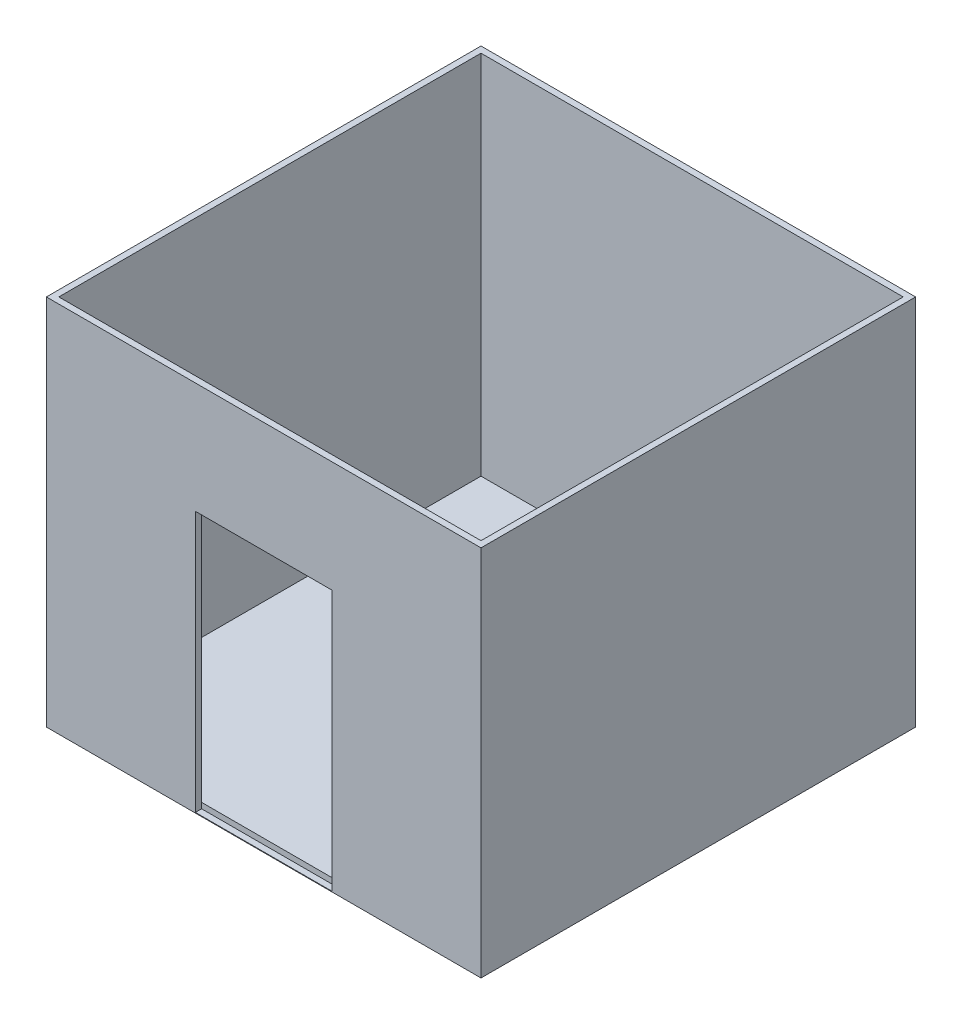
ISO-10303-21;
HEADER;
FILE_DESCRIPTION(('STEP AP214'),'2;1');
FILE_NAME('part.step','',(''),(''),'','','');
FILE_SCHEMA(('AUTOMOTIVE_DESIGN { 1 0 10303 214 1 1 1 1 }'));
ENDSEC;
DATA;
#1=APPLICATION_CONTEXT('core data for automotive mechanical design processes');
#2=APPLICATION_PROTOCOL_DEFINITION('international standard','automotive_design',2000,#1);
#3=PRODUCT_CONTEXT('',#1,'mechanical');
#4=PRODUCT('Part','Part','',(#3));
#5=PRODUCT_RELATED_PRODUCT_CATEGORY('part','',(#4));
#6=PRODUCT_DEFINITION_FORMATION('','',#4);
#7=PRODUCT_DEFINITION_CONTEXT('part definition',#1,'design');
#8=PRODUCT_DEFINITION('design','',#6,#7);
#9=PRODUCT_DEFINITION_SHAPE('','',#8);
#10=(LENGTH_UNIT() NAMED_UNIT(*) SI_UNIT(.MILLI.,.METRE.));
#11=(NAMED_UNIT(*) PLANE_ANGLE_UNIT() SI_UNIT($,.RADIAN.));
#12=(NAMED_UNIT(*) SI_UNIT($,.STERADIAN.) SOLID_ANGLE_UNIT());
#13=UNCERTAINTY_MEASURE_WITH_UNIT(LENGTH_MEASURE(1.E-05),#10,'distance_accuracy_value','');
#14=(GEOMETRIC_REPRESENTATION_CONTEXT(3) GLOBAL_UNCERTAINTY_ASSIGNED_CONTEXT((#13)) GLOBAL_UNIT_ASSIGNED_CONTEXT((#10,
#11,#12)) REPRESENTATION_CONTEXT('',''));
#15=CARTESIAN_POINT('',(0.,0.,0.));
#16=DIRECTION('',(0.,0.,1.));
#17=DIRECTION('',(1.,0.,0.));
#18=AXIS2_PLACEMENT_3D('',#15,#16,#17);
#19=CARTESIAN_POINT('',(-1750.,3000.,1750.));
#20=DIRECTION('',(1.,0.,0.));
#21=DIRECTION('',(0.,0.,-1.));
#22=AXIS2_PLACEMENT_3D('',#19,#20,#21);
#23=PLANE('',#22);
#24=DIRECTION('',(0.,0.,1.));
#25=VECTOR('',#24,1.);
#26=CARTESIAN_POINT('',(-1750.,0.,1750.));
#27=LINE('',#26,#25);
#28=CARTESIAN_POINT('',(-1750.,0.,-1750.));
#29=VERTEX_POINT('',#28);
#30=CARTESIAN_POINT('',(-1750.,0.,1750.));
#31=VERTEX_POINT('',#30);
#32=EDGE_CURVE('E174',#29,#31,#27,.T.);
#33=ORIENTED_EDGE('',*,*,#32,.T.);
#34=DIRECTION('',(0.,-1.,0.));
#35=VECTOR('',#34,1.);
#36=CARTESIAN_POINT('',(-1750.,3000.,1750.));
#37=LINE('',#36,#35);
#38=CARTESIAN_POINT('',(-1750.,3000.,1750.));
#39=VERTEX_POINT('',#38);
#40=EDGE_CURVE('E11',#39,#31,#37,.T.);
#41=ORIENTED_EDGE('',*,*,#40,.F.);
#42=DIRECTION('',(0.,0.,1.));
#43=VECTOR('',#42,1.);
#44=CARTESIAN_POINT('',(-1750.,3000.,1750.));
#45=LINE('',#44,#43);
#46=CARTESIAN_POINT('',(-1750.,3000.,-1750.));
#47=VERTEX_POINT('',#46);
#48=EDGE_CURVE('E200',#47,#39,#45,.T.);
#49=ORIENTED_EDGE('',*,*,#48,.F.);
#50=DIRECTION('',(0.,-1.,0.));
#51=VECTOR('',#50,1.);
#52=CARTESIAN_POINT('',(-1750.,3000.,-1750.));
#53=LINE('',#52,#51);
#54=EDGE_CURVE('E210',#47,#29,#53,.T.);
#55=ORIENTED_EDGE('',*,*,#54,.T.);
#56=EDGE_LOOP('',(#33,#41,#49,#55));
#57=FACE_BOUND('',#56,.T.);
#58=ADVANCED_FACE('F33',(#57),#23,.F.);
#59=CARTESIAN_POINT('',(1750.,3000.,1750.));
#60=DIRECTION('',(0.,0.,-1.));
#61=DIRECTION('',(-1.,0.,0.));
#62=AXIS2_PLACEMENT_3D('',#59,#60,#61);
#63=PLANE('',#62);
#64=DIRECTION('',(1.,0.,0.));
#65=VECTOR('',#64,1.);
#66=CARTESIAN_POINT('',(-550.,4.99999999999989,1750.));
#67=LINE('',#66,#65);
#68=CARTESIAN_POINT('',(-550.,4.99999999999989,1750.));
#69=VERTEX_POINT('',#68);
#70=CARTESIAN_POINT('',(550.000000000001,4.99999999999989,1750.));
#71=VERTEX_POINT('',#70);
#72=EDGE_CURVE('E155',#69,#71,#67,.T.);
#73=ORIENTED_EDGE('',*,*,#72,.F.);
#74=DIRECTION('',(0.,-1.,0.));
#75=VECTOR('',#74,1.);
#76=CARTESIAN_POINT('',(-550.,2105.,1750.));
#77=LINE('',#76,#75);
#78=CARTESIAN_POINT('',(-550.,2105.,1750.));
#79=VERTEX_POINT('',#78);
#80=EDGE_CURVE('E47',#79,#69,#77,.T.);
#81=ORIENTED_EDGE('',*,*,#80,.F.);
#82=DIRECTION('',(-1.,0.,0.));
#83=VECTOR('',#82,1.);
#84=CARTESIAN_POINT('',(-550.,2105.,1750.));
#85=LINE('',#84,#83);
#86=CARTESIAN_POINT('',(550.,2105.,1750.));
#87=VERTEX_POINT('',#86);
#88=EDGE_CURVE('E136',#87,#79,#85,.T.);
#89=ORIENTED_EDGE('',*,*,#88,.F.);
#90=DIRECTION('',(0.,1.,0.));
#91=VECTOR('',#90,1.);
#92=CARTESIAN_POINT('',(550.,2105.,1750.));
#93=LINE('',#92,#91);
#94=EDGE_CURVE('E157',#71,#87,#93,.T.);
#95=ORIENTED_EDGE('',*,*,#94,.F.);
#96=EDGE_LOOP('',(#73,#81,#89,#95));
#97=FACE_BOUND('',#96,.T.);
#98=DIRECTION('',(1.,0.,0.));
#99=VECTOR('',#98,1.);
#100=CARTESIAN_POINT('',(1750.,0.,1750.));
#101=LINE('',#100,#99);
#102=CARTESIAN_POINT('',(1750.,0.,1750.));
#103=VERTEX_POINT('',#102);
#104=EDGE_CURVE('E213',#31,#103,#101,.T.);
#105=ORIENTED_EDGE('',*,*,#104,.T.);
#106=DIRECTION('',(0.,-1.,0.));
#107=VECTOR('',#106,1.);
#108=CARTESIAN_POINT('',(1750.,3000.,1750.));
#109=LINE('',#108,#107);
#110=CARTESIAN_POINT('',(1750.,3000.,1750.));
#111=VERTEX_POINT('',#110);
#112=EDGE_CURVE('E40',#111,#103,#109,.T.);
#113=ORIENTED_EDGE('',*,*,#112,.F.);
#114=DIRECTION('',(1.,0.,0.));
#115=VECTOR('',#114,1.);
#116=CARTESIAN_POINT('',(1750.,3000.,1750.));
#117=LINE('',#116,#115);
#118=EDGE_CURVE('E203',#39,#111,#117,.T.);
#119=ORIENTED_EDGE('',*,*,#118,.F.);
#120=ORIENTED_EDGE('',*,*,#40,.T.);
#121=EDGE_LOOP('',(#105,#113,#119,#120));
#122=FACE_BOUND('',#121,.T.);
#123=ADVANCED_FACE('F243',(#97,#122),#63,.F.);
#124=CARTESIAN_POINT('',(1750.,3000.,1750.));
#125=DIRECTION('',(-1.,0.,0.));
#126=DIRECTION('',(0.,0.,1.));
#127=AXIS2_PLACEMENT_3D('',#124,#125,#126);
#128=PLANE('',#127);
#129=DIRECTION('',(0.,0.,-1.));
#130=VECTOR('',#129,1.);
#131=CARTESIAN_POINT('',(1750.,0.,1750.));
#132=LINE('',#131,#130);
#133=CARTESIAN_POINT('',(1750.,0.,-1750.));
#134=VERTEX_POINT('',#133);
#135=EDGE_CURVE('E215',#103,#134,#132,.T.);
#136=ORIENTED_EDGE('',*,*,#135,.T.);
#137=DIRECTION('',(0.,-1.,0.));
#138=VECTOR('',#137,1.);
#139=CARTESIAN_POINT('',(1750.,3000.,-1750.));
#140=LINE('',#139,#138);
#141=CARTESIAN_POINT('',(1750.,3000.,-1750.));
#142=VERTEX_POINT('',#141);
#143=EDGE_CURVE('E220',#142,#134,#140,.T.);
#144=ORIENTED_EDGE('',*,*,#143,.F.);
#145=DIRECTION('',(0.,0.,-1.));
#146=VECTOR('',#145,1.);
#147=CARTESIAN_POINT('',(1750.,3000.,1750.));
#148=LINE('',#147,#146);
#149=EDGE_CURVE('E206',#111,#142,#148,.T.);
#150=ORIENTED_EDGE('',*,*,#149,.F.);
#151=ORIENTED_EDGE('',*,*,#112,.T.);
#152=EDGE_LOOP('',(#136,#144,#150,#151));
#153=FACE_BOUND('',#152,.T.);
#154=ADVANCED_FACE('F227',(#153),#128,.F.);
#155=CARTESIAN_POINT('',(1750.,3000.,-1750.));
#156=DIRECTION('',(0.,0.,1.));
#157=DIRECTION('',(1.,0.,0.));
#158=AXIS2_PLACEMENT_3D('',#155,#156,#157);
#159=PLANE('',#158);
#160=DIRECTION('',(-1.,0.,0.));
#161=VECTOR('',#160,1.);
#162=CARTESIAN_POINT('',(1750.,0.,-1750.));
#163=LINE('',#162,#161);
#164=EDGE_CURVE('E204',#134,#29,#163,.T.);
#165=ORIENTED_EDGE('',*,*,#164,.T.);
#166=ORIENTED_EDGE('',*,*,#54,.F.);
#167=DIRECTION('',(-1.,0.,0.));
#168=VECTOR('',#167,1.);
#169=CARTESIAN_POINT('',(1750.,3000.,-1750.));
#170=LINE('',#169,#168);
#171=EDGE_CURVE('E208',#142,#47,#170,.T.);
#172=ORIENTED_EDGE('',*,*,#171,.F.);
#173=ORIENTED_EDGE('',*,*,#143,.T.);
#174=EDGE_LOOP('',(#165,#166,#172,#173));
#175=FACE_BOUND('',#174,.T.);
#176=ADVANCED_FACE('F236',(#175),#159,.F.);
#177=CARTESIAN_POINT('',(0.,3000.,0.));
#178=DIRECTION('',(0.,1.,0.));
#179=DIRECTION('',(0.,0.,1.));
#180=AXIS2_PLACEMENT_3D('',#177,#178,#179);
#181=PLANE('',#180);
#182=DIRECTION('',(0.,0.,1.));
#183=VECTOR('',#182,1.);
#184=CARTESIAN_POINT('',(-1700.,3000.,1750.));
#185=LINE('',#184,#183);
#186=CARTESIAN_POINT('',(-1700.,3000.,-1700.));
#187=VERTEX_POINT('',#186);
#188=CARTESIAN_POINT('',(-1700.,3000.,1700.));
#189=VERTEX_POINT('',#188);
#190=EDGE_CURVE('E192',#187,#189,#185,.T.);
#191=ORIENTED_EDGE('',*,*,#190,.F.);
#192=DIRECTION('',(-1.,0.,0.));
#193=VECTOR('',#192,1.);
#194=CARTESIAN_POINT('',(1750.,3000.,-1700.));
#195=LINE('',#194,#193);
#196=CARTESIAN_POINT('',(1700.,3000.,-1700.));
#197=VERTEX_POINT('',#196);
#198=EDGE_CURVE('E180',#197,#187,#195,.T.);
#199=ORIENTED_EDGE('',*,*,#198,.F.);
#200=DIRECTION('',(0.,0.,-1.));
#201=VECTOR('',#200,1.);
#202=CARTESIAN_POINT('',(1700.,3000.,1750.));
#203=LINE('',#202,#201);
#204=CARTESIAN_POINT('',(1700.,3000.,1700.));
#205=VERTEX_POINT('',#204);
#206=EDGE_CURVE('E196',#205,#197,#203,.T.);
#207=ORIENTED_EDGE('',*,*,#206,.F.);
#208=DIRECTION('',(1.,0.,0.));
#209=VECTOR('',#208,1.);
#210=CARTESIAN_POINT('',(1750.,3000.,1700.));
#211=LINE('',#210,#209);
#212=EDGE_CURVE('E194',#189,#205,#211,.T.);
#213=ORIENTED_EDGE('',*,*,#212,.F.);
#214=EDGE_LOOP('',(#191,#199,#207,#213));
#215=FACE_BOUND('',#214,.T.);
#216=ORIENTED_EDGE('',*,*,#48,.T.);
#217=ORIENTED_EDGE('',*,*,#118,.T.);
#218=ORIENTED_EDGE('',*,*,#149,.T.);
#219=ORIENTED_EDGE('',*,*,#171,.T.);
#220=EDGE_LOOP('',(#216,#217,#218,#219));
#221=FACE_BOUND('',#220,.T.);
#222=ADVANCED_FACE('F242',(#215,#221),#181,.T.);
#223=CARTESIAN_POINT('',(0.,0.,0.));
#224=DIRECTION('',(0.,1.,0.));
#225=DIRECTION('',(0.,0.,1.));
#226=AXIS2_PLACEMENT_3D('',#223,#224,#225);
#227=PLANE('',#226);
#228=ORIENTED_EDGE('',*,*,#32,.F.);
#229=ORIENTED_EDGE('',*,*,#164,.F.);
#230=ORIENTED_EDGE('',*,*,#135,.F.);
#231=ORIENTED_EDGE('',*,*,#104,.F.);
#232=EDGE_LOOP('',(#228,#229,#230,#231));
#233=FACE_BOUND('',#232,.T.);
#234=ADVANCED_FACE('F233',(#233),#227,.F.);
#235=CARTESIAN_POINT('',(-1700.,3000.,1750.));
#236=DIRECTION('',(1.,0.,0.));
#237=DIRECTION('',(0.,0.,-1.));
#238=AXIS2_PLACEMENT_3D('',#235,#236,#237);
#239=PLANE('',#238);
#240=DIRECTION('',(0.,0.,1.));
#241=VECTOR('',#240,1.);
#242=CARTESIAN_POINT('',(-1700.,49.9999999999998,1750.));
#243=LINE('',#242,#241);
#244=CARTESIAN_POINT('',(-1700.,50.,-1700.));
#245=VERTEX_POINT('',#244);
#246=CARTESIAN_POINT('',(-1700.,50.,1700.));
#247=VERTEX_POINT('',#246);
#248=EDGE_CURVE('E164',#245,#247,#243,.T.);
#249=ORIENTED_EDGE('',*,*,#248,.F.);
#250=DIRECTION('',(0.,-1.,0.));
#251=VECTOR('',#250,1.);
#252=CARTESIAN_POINT('',(-1700.,3000.,-1700.));
#253=LINE('',#252,#251);
#254=EDGE_CURVE('E176',#187,#245,#253,.T.);
#255=ORIENTED_EDGE('',*,*,#254,.F.);
#256=ORIENTED_EDGE('',*,*,#190,.T.);
#257=DIRECTION('',(0.,-1.,0.));
#258=VECTOR('',#257,1.);
#259=CARTESIAN_POINT('',(-1700.,3000.,1700.));
#260=LINE('',#259,#258);
#261=EDGE_CURVE('E171',#189,#247,#260,.T.);
#262=ORIENTED_EDGE('',*,*,#261,.T.);
#263=EDGE_LOOP('',(#249,#255,#256,#262));
#264=FACE_BOUND('',#263,.T.);
#265=ADVANCED_FACE('F256',(#264),#239,.T.);
#266=CARTESIAN_POINT('',(1750.,3000.,1700.));
#267=DIRECTION('',(0.,0.,-1.));
#268=DIRECTION('',(-1.,0.,0.));
#269=AXIS2_PLACEMENT_3D('',#266,#267,#268);
#270=PLANE('',#269);
#271=DIRECTION('',(0.,-1.,0.));
#272=VECTOR('',#271,1.);
#273=CARTESIAN_POINT('',(-550.,2105.,1700.));
#274=LINE('',#273,#272);
#275=CARTESIAN_POINT('',(-550.,2105.,1700.));
#276=VERTEX_POINT('',#275);
#277=CARTESIAN_POINT('',(-550.,49.9999999999998,1700.));
#278=VERTEX_POINT('',#277);
#279=EDGE_CURVE('E135',#276,#278,#274,.T.);
#280=ORIENTED_EDGE('',*,*,#279,.T.);
#281=DIRECTION('',(1.,0.,0.));
#282=VECTOR('',#281,1.);
#283=CARTESIAN_POINT('',(1750.,49.9999999999998,1700.));
#284=LINE('',#283,#282);
#285=EDGE_CURVE('E181',#247,#278,#284,.T.);
#286=ORIENTED_EDGE('',*,*,#285,.F.);
#287=ORIENTED_EDGE('',*,*,#261,.F.);
#288=ORIENTED_EDGE('',*,*,#212,.T.);
#289=DIRECTION('',(0.,-1.,0.));
#290=VECTOR('',#289,1.);
#291=CARTESIAN_POINT('',(1700.,3000.,1700.));
#292=LINE('',#291,#290);
#293=CARTESIAN_POINT('',(1700.,50.,1700.));
#294=VERTEX_POINT('',#293);
#295=EDGE_CURVE('E175',#205,#294,#292,.T.);
#296=ORIENTED_EDGE('',*,*,#295,.T.);
#297=CARTESIAN_POINT('',(550.000000000001,49.9999999999998,1700.));
#298=VERTEX_POINT('',#297);
#299=EDGE_CURVE('E170',#298,#294,#284,.T.);
#300=ORIENTED_EDGE('',*,*,#299,.F.);
#301=DIRECTION('',(0.,1.,0.));
#302=VECTOR('',#301,1.);
#303=CARTESIAN_POINT('',(550.,2105.,1700.));
#304=LINE('',#303,#302);
#305=CARTESIAN_POINT('',(550.,2105.,1700.));
#306=VERTEX_POINT('',#305);
#307=EDGE_CURVE('E147',#298,#306,#304,.T.);
#308=ORIENTED_EDGE('',*,*,#307,.T.);
#309=DIRECTION('',(-1.,0.,0.));
#310=VECTOR('',#309,1.);
#311=CARTESIAN_POINT('',(-550.,2105.,1700.));
#312=LINE('',#311,#310);
#313=EDGE_CURVE('E144',#306,#276,#312,.T.);
#314=ORIENTED_EDGE('',*,*,#313,.T.);
#315=EDGE_LOOP('',(#280,#286,#287,#288,#296,#300,#308,#314));
#316=FACE_BOUND('',#315,.T.);
#317=ADVANCED_FACE('F271',(#316),#270,.T.);
#318=CARTESIAN_POINT('',(1700.,3000.,1750.));
#319=DIRECTION('',(-1.,0.,0.));
#320=DIRECTION('',(0.,0.,1.));
#321=AXIS2_PLACEMENT_3D('',#318,#319,#320);
#322=PLANE('',#321);
#323=DIRECTION('',(0.,0.,-1.));
#324=VECTOR('',#323,1.);
#325=CARTESIAN_POINT('',(1700.,49.9999999999998,1750.));
#326=LINE('',#325,#324);
#327=CARTESIAN_POINT('',(1700.,50.,-1700.));
#328=VERTEX_POINT('',#327);
#329=EDGE_CURVE('E184',#294,#328,#326,.T.);
#330=ORIENTED_EDGE('',*,*,#329,.F.);
#331=ORIENTED_EDGE('',*,*,#295,.F.);
#332=ORIENTED_EDGE('',*,*,#206,.T.);
#333=DIRECTION('',(0.,-1.,0.));
#334=VECTOR('',#333,1.);
#335=CARTESIAN_POINT('',(1700.,3000.,-1700.));
#336=LINE('',#335,#334);
#337=EDGE_CURVE('E179',#197,#328,#336,.T.);
#338=ORIENTED_EDGE('',*,*,#337,.T.);
#339=EDGE_LOOP('',(#330,#331,#332,#338));
#340=FACE_BOUND('',#339,.T.);
#341=ADVANCED_FACE('F267',(#340),#322,.T.);
#342=CARTESIAN_POINT('',(1750.,3000.,-1700.));
#343=DIRECTION('',(0.,0.,1.));
#344=DIRECTION('',(1.,0.,0.));
#345=AXIS2_PLACEMENT_3D('',#342,#343,#344);
#346=PLANE('',#345);
#347=DIRECTION('',(-1.,0.,0.));
#348=VECTOR('',#347,1.);
#349=CARTESIAN_POINT('',(1750.,49.9999999999998,-1700.));
#350=LINE('',#349,#348);
#351=EDGE_CURVE('E188',#328,#245,#350,.T.);
#352=ORIENTED_EDGE('',*,*,#351,.F.);
#353=ORIENTED_EDGE('',*,*,#337,.F.);
#354=ORIENTED_EDGE('',*,*,#198,.T.);
#355=ORIENTED_EDGE('',*,*,#254,.T.);
#356=EDGE_LOOP('',(#352,#353,#354,#355));
#357=FACE_BOUND('',#356,.T.);
#358=ADVANCED_FACE('F263',(#357),#346,.T.);
#359=CARTESIAN_POINT('',(0.,50.,0.));
#360=DIRECTION('',(0.,1.,0.));
#361=DIRECTION('',(0.,0.,1.));
#362=AXIS2_PLACEMENT_3D('',#359,#360,#361);
#363=PLANE('',#362);
#364=ORIENTED_EDGE('',*,*,#248,.T.);
#365=ORIENTED_EDGE('',*,*,#285,.T.);
#366=EDGE_CURVE('E132',#278,#298,#284,.T.);
#367=ORIENTED_EDGE('',*,*,#366,.T.);
#368=ORIENTED_EDGE('',*,*,#299,.T.);
#369=ORIENTED_EDGE('',*,*,#329,.T.);
#370=ORIENTED_EDGE('',*,*,#351,.T.);
#371=EDGE_LOOP('',(#364,#365,#367,#368,#369,#370));
#372=FACE_BOUND('',#371,.T.);
#373=ADVANCED_FACE('F260',(#372),#363,.T.);
#374=CARTESIAN_POINT('',(-550.,2105.,1700.));
#375=DIRECTION('',(-1.,0.,0.));
#376=DIRECTION('',(0.,-1.,0.));
#377=AXIS2_PLACEMENT_3D('',#374,#375,#376);
#378=PLANE('',#377);
#379=ORIENTED_EDGE('',*,*,#80,.T.);
#380=DIRECTION('',(0.,0.,1.));
#381=VECTOR('',#380,1.);
#382=CARTESIAN_POINT('',(-550.,4.99999999999989,1700.));
#383=LINE('',#382,#381);
#384=CARTESIAN_POINT('',(-550.,4.99999999999989,1700.));
#385=VERTEX_POINT('',#384);
#386=EDGE_CURVE('E138',#385,#69,#383,.T.);
#387=ORIENTED_EDGE('',*,*,#386,.F.);
#388=EDGE_CURVE('E127',#278,#385,#274,.T.);
#389=ORIENTED_EDGE('',*,*,#388,.F.);
#390=ORIENTED_EDGE('',*,*,#279,.F.);
#391=DIRECTION('',(0.,0.,1.));
#392=VECTOR('',#391,1.);
#393=CARTESIAN_POINT('',(-550.,2105.,1700.));
#394=LINE('',#393,#392);
#395=EDGE_CURVE('E162',#276,#79,#394,.T.);
#396=ORIENTED_EDGE('',*,*,#395,.T.);
#397=EDGE_LOOP('',(#379,#387,#389,#390,#396));
#398=FACE_BOUND('',#397,.T.);
#399=ADVANCED_FACE('F139',(#398),#378,.F.);
#400=CARTESIAN_POINT('',(-550.,2105.,1700.));
#401=DIRECTION('',(0.,1.,0.));
#402=DIRECTION('',(0.,0.,1.));
#403=AXIS2_PLACEMENT_3D('',#400,#401,#402);
#404=PLANE('',#403);
#405=ORIENTED_EDGE('',*,*,#88,.T.);
#406=ORIENTED_EDGE('',*,*,#395,.F.);
#407=ORIENTED_EDGE('',*,*,#313,.F.);
#408=DIRECTION('',(0.,0.,1.));
#409=VECTOR('',#408,1.);
#410=CARTESIAN_POINT('',(550.,2105.,1700.));
#411=LINE('',#410,#409);
#412=EDGE_CURVE('E165',#306,#87,#411,.T.);
#413=ORIENTED_EDGE('',*,*,#412,.T.);
#414=EDGE_LOOP('',(#405,#406,#407,#413));
#415=FACE_BOUND('',#414,.T.);
#416=ADVANCED_FACE('F281',(#415),#404,.F.);
#417=CARTESIAN_POINT('',(550.,2105.,1700.));
#418=DIRECTION('',(1.,0.,0.));
#419=DIRECTION('',(0.,1.,0.));
#420=AXIS2_PLACEMENT_3D('',#417,#418,#419);
#421=PLANE('',#420);
#422=ORIENTED_EDGE('',*,*,#94,.T.);
#423=ORIENTED_EDGE('',*,*,#412,.F.);
#424=ORIENTED_EDGE('',*,*,#307,.F.);
#425=CARTESIAN_POINT('',(550.000000000001,4.99999999999989,1700.));
#426=VERTEX_POINT('',#425);
#427=EDGE_CURVE('E55',#426,#298,#304,.T.);
#428=ORIENTED_EDGE('',*,*,#427,.F.);
#429=DIRECTION('',(0.,0.,1.));
#430=VECTOR('',#429,1.);
#431=CARTESIAN_POINT('',(550.000000000001,4.99999999999989,1700.));
#432=LINE('',#431,#430);
#433=EDGE_CURVE('E143',#426,#71,#432,.T.);
#434=ORIENTED_EDGE('',*,*,#433,.T.);
#435=EDGE_LOOP('',(#422,#423,#424,#428,#434));
#436=FACE_BOUND('',#435,.T.);
#437=ADVANCED_FACE('F284',(#436),#421,.F.);
#438=CARTESIAN_POINT('',(-550.,4.99999999999989,1700.));
#439=DIRECTION('',(0.,-1.,0.));
#440=DIRECTION('',(0.,0.,-1.));
#441=AXIS2_PLACEMENT_3D('',#438,#439,#440);
#442=PLANE('',#441);
#443=ORIENTED_EDGE('',*,*,#72,.T.);
#444=ORIENTED_EDGE('',*,*,#433,.F.);
#445=DIRECTION('',(1.,0.,0.));
#446=VECTOR('',#445,1.);
#447=CARTESIAN_POINT('',(-550.,4.99999999999989,1700.));
#448=LINE('',#447,#446);
#449=EDGE_CURVE('E130',#385,#426,#448,.T.);
#450=ORIENTED_EDGE('',*,*,#449,.F.);
#451=ORIENTED_EDGE('',*,*,#386,.T.);
#452=EDGE_LOOP('',(#443,#444,#450,#451));
#453=FACE_BOUND('',#452,.T.);
#454=ADVANCED_FACE('F146',(#453),#442,.F.);
#455=CARTESIAN_POINT('',(0.,0.,1700.));
#456=DIRECTION('',(0.,0.,1.));
#457=DIRECTION('',(1.,0.,0.));
#458=AXIS2_PLACEMENT_3D('',#455,#456,#457);
#459=PLANE('',#458);
#460=ORIENTED_EDGE('',*,*,#388,.T.);
#461=ORIENTED_EDGE('',*,*,#449,.T.);
#462=ORIENTED_EDGE('',*,*,#427,.T.);
#463=ORIENTED_EDGE('',*,*,#366,.F.);
#464=EDGE_LOOP('',(#460,#461,#462,#463));
#465=FACE_BOUND('',#464,.T.);
#466=ADVANCED_FACE('F128',(#465),#459,.T.);
#467=CLOSED_SHELL('',(#58,#123,#154,#176,#222,#234,#265,#317,#341,#358,#373,#399,#416,#437,#454,#466));
#468=MANIFOLD_SOLID_BREP('B2',#467);
#469=ADVANCED_BREP_SHAPE_REPRESENTATION('',(#18,#468),#14);
#470=SHAPE_DEFINITION_REPRESENTATION(#9,#469);
ENDSEC;
END-ISO-10303-21;
